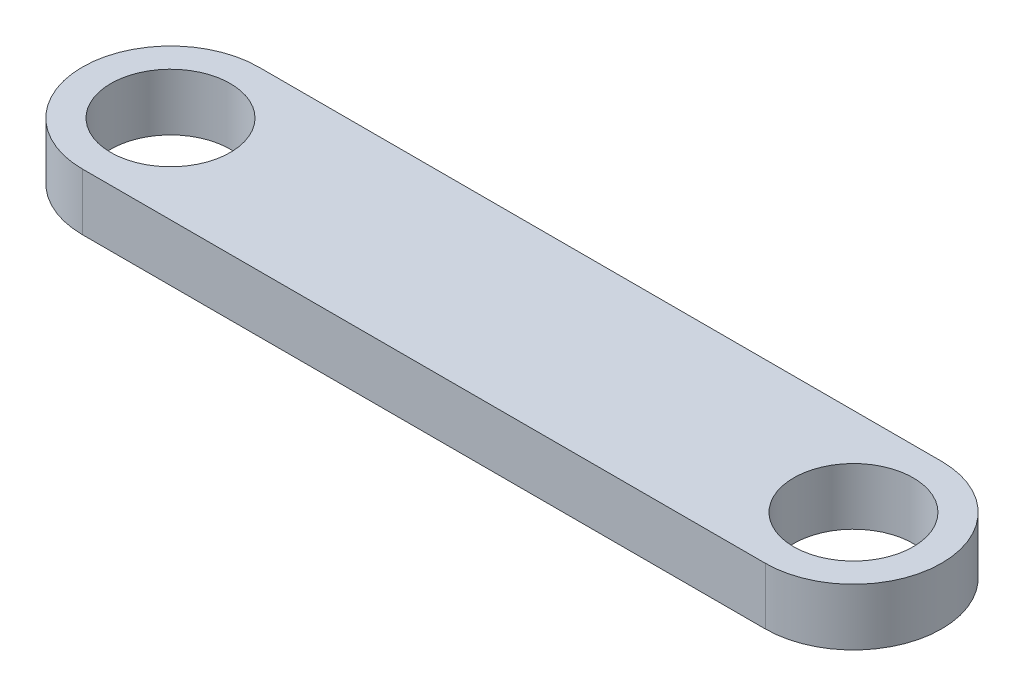
ISO-10303-21;
HEADER;
FILE_DESCRIPTION(('STEP AP214'),'2;1');
FILE_NAME('part.step','',(''),(''),'','','');
FILE_SCHEMA(('AUTOMOTIVE_DESIGN { 1 0 10303 214 1 1 1 1 }'));
ENDSEC;
DATA;
#1=APPLICATION_CONTEXT('core data for automotive mechanical design processes');
#2=APPLICATION_PROTOCOL_DEFINITION('international standard','automotive_design',2000,#1);
#3=PRODUCT_CONTEXT('',#1,'mechanical');
#4=PRODUCT('Part','Part','',(#3));
#5=PRODUCT_RELATED_PRODUCT_CATEGORY('part','',(#4));
#6=PRODUCT_DEFINITION_FORMATION('','',#4);
#7=PRODUCT_DEFINITION_CONTEXT('part definition',#1,'design');
#8=PRODUCT_DEFINITION('design','',#6,#7);
#9=PRODUCT_DEFINITION_SHAPE('','',#8);
#10=(LENGTH_UNIT() NAMED_UNIT(*) SI_UNIT(.MILLI.,.METRE.));
#11=(NAMED_UNIT(*) PLANE_ANGLE_UNIT() SI_UNIT($,.RADIAN.));
#12=(NAMED_UNIT(*) SI_UNIT($,.STERADIAN.) SOLID_ANGLE_UNIT());
#13=UNCERTAINTY_MEASURE_WITH_UNIT(LENGTH_MEASURE(1.E-05),#10,'distance_accuracy_value','');
#14=(GEOMETRIC_REPRESENTATION_CONTEXT(3) GLOBAL_UNCERTAINTY_ASSIGNED_CONTEXT((#13)) GLOBAL_UNIT_ASSIGNED_CONTEXT((#10,
#11,#12)) REPRESENTATION_CONTEXT('',''));
#15=CARTESIAN_POINT('',(0.,0.,0.));
#16=DIRECTION('',(0.,0.,1.));
#17=DIRECTION('',(1.,0.,0.));
#18=AXIS2_PLACEMENT_3D('',#15,#16,#17);
#19=CARTESIAN_POINT('',(0.,2.54,0.));
#20=DIRECTION('',(0.,1.,0.));
#21=DIRECTION('',(0.,0.,1.));
#22=AXIS2_PLACEMENT_3D('',#19,#20,#21);
#23=PLANE('',#22);
#24=CARTESIAN_POINT('',(0.,2.54,0.));
#25=DIRECTION('',(0.,1.,0.));
#26=DIRECTION('',(0.,0.,1.));
#27=AXIS2_PLACEMENT_3D('',#24,#25,#26);
#28=CIRCLE('',#27,2.667);
#29=CARTESIAN_POINT('',(0.,2.54,2.667));
#30=VERTEX_POINT('',#29);
#31=EDGE_CURVE('E99',#30,#30,#28,.T.);
#32=ORIENTED_EDGE('',*,*,#31,.F.);
#33=EDGE_LOOP('',(#32));
#34=FACE_BOUND('',#33,.T.);
#35=CARTESIAN_POINT('',(0.,2.54,0.));
#36=DIRECTION('',(0.,1.,0.));
#37=DIRECTION('',(0.,0.,1.));
#38=AXIS2_PLACEMENT_3D('',#35,#36,#37);
#39=CIRCLE('',#38,3.937);
#40=CARTESIAN_POINT('',(0.,2.54,-3.937));
#41=VERTEX_POINT('',#40);
#42=CARTESIAN_POINT('',(0.,2.54,3.937));
#43=VERTEX_POINT('',#42);
#44=EDGE_CURVE('E84',#41,#43,#39,.T.);
#45=ORIENTED_EDGE('',*,*,#44,.T.);
#46=DIRECTION('',(1.,0.,0.));
#47=VECTOR('',#46,1.);
#48=CARTESIAN_POINT('',(0.,2.54,3.937));
#49=LINE('',#48,#47);
#50=CARTESIAN_POINT('',(30.48,2.54,3.937));
#51=VERTEX_POINT('',#50);
#52=EDGE_CURVE('E79',#43,#51,#49,.T.);
#53=ORIENTED_EDGE('',*,*,#52,.T.);
#54=CARTESIAN_POINT('',(30.48,2.54,0.));
#55=DIRECTION('',(0.,1.,0.));
#56=DIRECTION('',(0.,0.,1.));
#57=AXIS2_PLACEMENT_3D('',#54,#55,#56);
#58=CIRCLE('',#57,3.937);
#59=CARTESIAN_POINT('',(30.48,2.54,-3.937));
#60=VERTEX_POINT('',#59);
#61=EDGE_CURVE('E82',#51,#60,#58,.T.);
#62=ORIENTED_EDGE('',*,*,#61,.T.);
#63=DIRECTION('',(-1.,0.,0.));
#64=VECTOR('',#63,1.);
#65=CARTESIAN_POINT('',(0.,2.54,-3.937));
#66=LINE('',#65,#64);
#67=EDGE_CURVE('E49',#60,#41,#66,.T.);
#68=ORIENTED_EDGE('',*,*,#67,.T.);
#69=EDGE_LOOP('',(#45,#53,#62,#68));
#70=FACE_BOUND('',#69,.T.);
#71=CARTESIAN_POINT('',(30.48,2.54,0.));
#72=DIRECTION('',(0.,1.,0.));
#73=DIRECTION('',(0.,0.,1.));
#74=AXIS2_PLACEMENT_3D('',#71,#72,#73);
#75=CIRCLE('',#74,2.667);
#76=CARTESIAN_POINT('',(30.48,2.54,2.667));
#77=VERTEX_POINT('',#76);
#78=EDGE_CURVE('E114',#77,#77,#75,.T.);
#79=ORIENTED_EDGE('',*,*,#78,.F.);
#80=EDGE_LOOP('',(#79));
#81=FACE_BOUND('',#80,.T.);
#82=ADVANCED_FACE('F32',(#34,#70,#81),#23,.T.);
#83=CARTESIAN_POINT('',(0.,0.,0.));
#84=DIRECTION('',(0.,1.,0.));
#85=DIRECTION('',(0.,0.,1.));
#86=AXIS2_PLACEMENT_3D('',#83,#84,#85);
#87=PLANE('',#86);
#88=CARTESIAN_POINT('',(0.,0.,0.));
#89=DIRECTION('',(0.,1.,0.));
#90=DIRECTION('',(0.,0.,1.));
#91=AXIS2_PLACEMENT_3D('',#88,#89,#90);
#92=CIRCLE('',#91,3.937);
#93=CARTESIAN_POINT('',(0.,0.,-3.937));
#94=VERTEX_POINT('',#93);
#95=CARTESIAN_POINT('',(0.,0.,3.937));
#96=VERTEX_POINT('',#95);
#97=EDGE_CURVE('E96',#94,#96,#92,.T.);
#98=ORIENTED_EDGE('',*,*,#97,.F.);
#99=DIRECTION('',(-1.,0.,0.));
#100=VECTOR('',#99,1.);
#101=CARTESIAN_POINT('',(0.,0.,-3.937));
#102=LINE('',#101,#100);
#103=CARTESIAN_POINT('',(30.48,0.,-3.937));
#104=VERTEX_POINT('',#103);
#105=EDGE_CURVE('E72',#104,#94,#102,.T.);
#106=ORIENTED_EDGE('',*,*,#105,.F.);
#107=CARTESIAN_POINT('',(30.48,0.,0.));
#108=DIRECTION('',(0.,1.,0.));
#109=DIRECTION('',(0.,0.,1.));
#110=AXIS2_PLACEMENT_3D('',#107,#108,#109);
#111=CIRCLE('',#110,3.937);
#112=CARTESIAN_POINT('',(30.48,0.,3.937));
#113=VERTEX_POINT('',#112);
#114=EDGE_CURVE('E66',#113,#104,#111,.T.);
#115=ORIENTED_EDGE('',*,*,#114,.F.);
#116=DIRECTION('',(1.,0.,0.));
#117=VECTOR('',#116,1.);
#118=CARTESIAN_POINT('',(0.,0.,3.937));
#119=LINE('',#118,#117);
#120=EDGE_CURVE('E88',#96,#113,#119,.T.);
#121=ORIENTED_EDGE('',*,*,#120,.F.);
#122=EDGE_LOOP('',(#98,#106,#115,#121));
#123=FACE_BOUND('',#122,.T.);
#124=CARTESIAN_POINT('',(0.,0.,0.));
#125=DIRECTION('',(0.,1.,0.));
#126=DIRECTION('',(0.,0.,1.));
#127=AXIS2_PLACEMENT_3D('',#124,#125,#126);
#128=CIRCLE('',#127,2.667);
#129=CARTESIAN_POINT('',(0.,0.,2.667));
#130=VERTEX_POINT('',#129);
#131=EDGE_CURVE('E111',#130,#130,#128,.T.);
#132=ORIENTED_EDGE('',*,*,#131,.T.);
#133=EDGE_LOOP('',(#132));
#134=FACE_BOUND('',#133,.T.);
#135=CARTESIAN_POINT('',(30.48,0.,0.));
#136=DIRECTION('',(0.,1.,0.));
#137=DIRECTION('',(0.,0.,1.));
#138=AXIS2_PLACEMENT_3D('',#135,#136,#137);
#139=CIRCLE('',#138,2.667);
#140=CARTESIAN_POINT('',(30.48,0.,2.667));
#141=VERTEX_POINT('',#140);
#142=EDGE_CURVE('E117',#141,#141,#139,.T.);
#143=ORIENTED_EDGE('',*,*,#142,.T.);
#144=EDGE_LOOP('',(#143));
#145=FACE_BOUND('',#144,.T.);
#146=ADVANCED_FACE('F107',(#123,#134,#145),#87,.F.);
#147=CARTESIAN_POINT('',(0.,2.54,0.));
#148=DIRECTION('',(0.,-1.,0.));
#149=DIRECTION('',(0.,0.,-1.));
#150=AXIS2_PLACEMENT_3D('',#147,#148,#149);
#151=CYLINDRICAL_SURFACE('',#150,3.937);
#152=ORIENTED_EDGE('',*,*,#97,.T.);
#153=DIRECTION('',(0.,-1.,0.));
#154=VECTOR('',#153,1.);
#155=CARTESIAN_POINT('',(0.,2.54,3.937));
#156=LINE('',#155,#154);
#157=EDGE_CURVE('E11',#43,#96,#156,.T.);
#158=ORIENTED_EDGE('',*,*,#157,.F.);
#159=ORIENTED_EDGE('',*,*,#44,.F.);
#160=DIRECTION('',(0.,-1.,0.));
#161=VECTOR('',#160,1.);
#162=CARTESIAN_POINT('',(0.,2.54,-3.937));
#163=LINE('',#162,#161);
#164=EDGE_CURVE('E92',#41,#94,#163,.T.);
#165=ORIENTED_EDGE('',*,*,#164,.T.);
#166=EDGE_LOOP('',(#152,#158,#159,#165));
#167=FACE_BOUND('',#166,.T.);
#168=ADVANCED_FACE('F34',(#167),#151,.T.);
#169=CARTESIAN_POINT('',(0.,2.54,3.937));
#170=DIRECTION('',(0.,0.,-1.));
#171=DIRECTION('',(-1.,0.,0.));
#172=AXIS2_PLACEMENT_3D('',#169,#170,#171);
#173=PLANE('',#172);
#174=ORIENTED_EDGE('',*,*,#120,.T.);
#175=DIRECTION('',(0.,-1.,0.));
#176=VECTOR('',#175,1.);
#177=CARTESIAN_POINT('',(30.48,2.54,3.937));
#178=LINE('',#177,#176);
#179=EDGE_CURVE('E41',#51,#113,#178,.T.);
#180=ORIENTED_EDGE('',*,*,#179,.F.);
#181=ORIENTED_EDGE('',*,*,#52,.F.);
#182=ORIENTED_EDGE('',*,*,#157,.T.);
#183=EDGE_LOOP('',(#174,#180,#181,#182));
#184=FACE_BOUND('',#183,.T.);
#185=ADVANCED_FACE('F87',(#184),#173,.F.);
#186=CARTESIAN_POINT('',(30.48,2.54,0.));
#187=DIRECTION('',(0.,-1.,0.));
#188=DIRECTION('',(0.,0.,-1.));
#189=AXIS2_PLACEMENT_3D('',#186,#187,#188);
#190=CYLINDRICAL_SURFACE('',#189,3.937);
#191=ORIENTED_EDGE('',*,*,#114,.T.);
#192=DIRECTION('',(0.,-1.,0.));
#193=VECTOR('',#192,1.);
#194=CARTESIAN_POINT('',(30.48,2.54,-3.937));
#195=LINE('',#194,#193);
#196=EDGE_CURVE('E89',#60,#104,#195,.T.);
#197=ORIENTED_EDGE('',*,*,#196,.F.);
#198=ORIENTED_EDGE('',*,*,#61,.F.);
#199=ORIENTED_EDGE('',*,*,#179,.T.);
#200=EDGE_LOOP('',(#191,#197,#198,#199));
#201=FACE_BOUND('',#200,.T.);
#202=ADVANCED_FACE('F90',(#201),#190,.T.);
#203=CARTESIAN_POINT('',(0.,2.54,-3.937));
#204=DIRECTION('',(0.,0.,1.));
#205=DIRECTION('',(1.,0.,0.));
#206=AXIS2_PLACEMENT_3D('',#203,#204,#205);
#207=PLANE('',#206);
#208=ORIENTED_EDGE('',*,*,#105,.T.);
#209=ORIENTED_EDGE('',*,*,#164,.F.);
#210=ORIENTED_EDGE('',*,*,#67,.F.);
#211=ORIENTED_EDGE('',*,*,#196,.T.);
#212=EDGE_LOOP('',(#208,#209,#210,#211));
#213=FACE_BOUND('',#212,.T.);
#214=ADVANCED_FACE('F104',(#213),#207,.F.);
#215=CARTESIAN_POINT('',(0.,2.54,0.));
#216=DIRECTION('',(0.,-1.,0.));
#217=DIRECTION('',(0.,0.,-1.));
#218=AXIS2_PLACEMENT_3D('',#215,#216,#217);
#219=CYLINDRICAL_SURFACE('',#218,2.667);
#220=ORIENTED_EDGE('',*,*,#31,.T.);
#221=EDGE_LOOP('',(#220));
#222=FACE_BOUND('',#221,.T.);
#223=ORIENTED_EDGE('',*,*,#131,.F.);
#224=EDGE_LOOP('',(#223));
#225=FACE_BOUND('',#224,.T.);
#226=ADVANCED_FACE('F134',(#222,#225),#219,.F.);
#227=CARTESIAN_POINT('',(30.48,2.54,0.));
#228=DIRECTION('',(0.,-1.,0.));
#229=DIRECTION('',(0.,0.,-1.));
#230=AXIS2_PLACEMENT_3D('',#227,#228,#229);
#231=CYLINDRICAL_SURFACE('',#230,2.667);
#232=ORIENTED_EDGE('',*,*,#78,.T.);
#233=EDGE_LOOP('',(#232));
#234=FACE_BOUND('',#233,.T.);
#235=ORIENTED_EDGE('',*,*,#142,.F.);
#236=EDGE_LOOP('',(#235));
#237=FACE_BOUND('',#236,.T.);
#238=ADVANCED_FACE('F123',(#234,#237),#231,.F.);
#239=CLOSED_SHELL('',(#82,#146,#168,#185,#202,#214,#226,#238));
#240=MANIFOLD_SOLID_BREP('B2',#239);
#241=ADVANCED_BREP_SHAPE_REPRESENTATION('',(#18,#240),#14);
#242=SHAPE_DEFINITION_REPRESENTATION(#9,#241);
ENDSEC;
END-ISO-10303-21;
